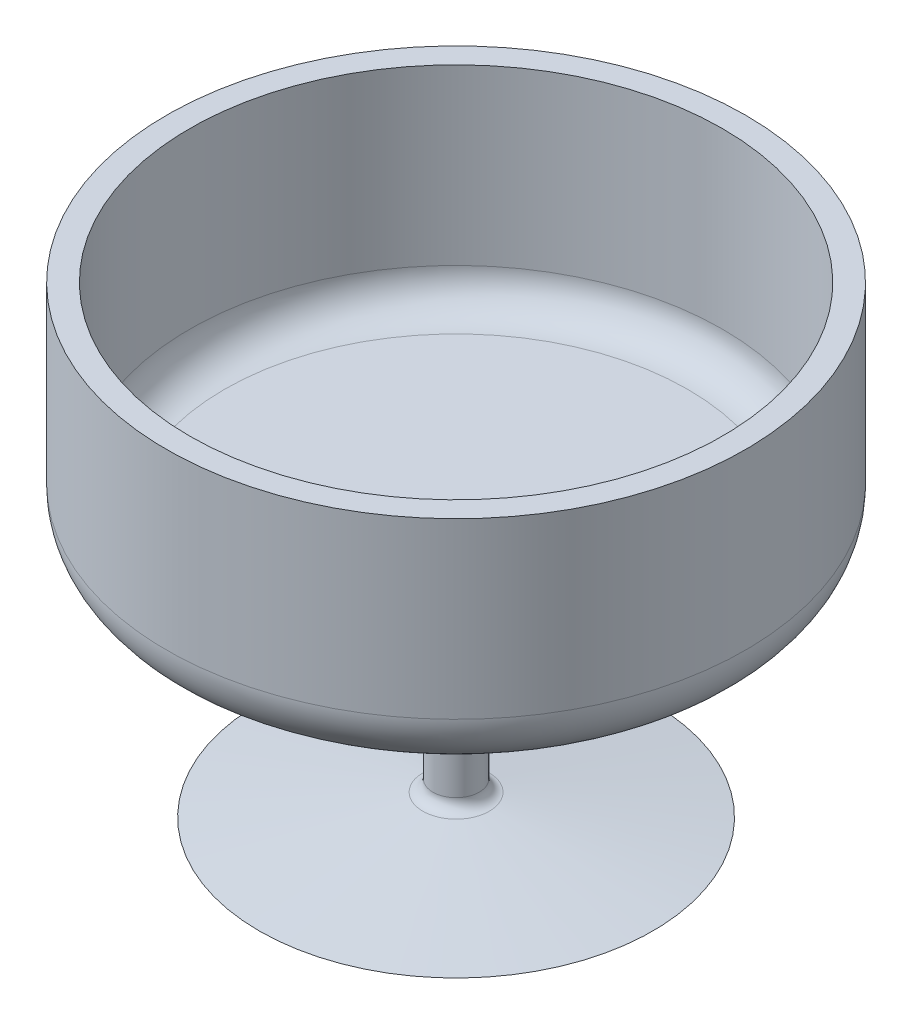
ISO-10303-21;
HEADER;
FILE_DESCRIPTION(('STEP AP214'),'2;1');
FILE_NAME('part.step','',(''),(''),'','','');
FILE_SCHEMA(('AUTOMOTIVE_DESIGN { 1 0 10303 214 1 1 1 1 }'));
ENDSEC;
DATA;
#1=APPLICATION_CONTEXT('core data for automotive mechanical design processes');
#2=APPLICATION_PROTOCOL_DEFINITION('international standard','automotive_design',2000,#1);
#3=PRODUCT_CONTEXT('',#1,'mechanical');
#4=PRODUCT('Part','Part','',(#3));
#5=PRODUCT_RELATED_PRODUCT_CATEGORY('part','',(#4));
#6=PRODUCT_DEFINITION_FORMATION('','',#4);
#7=PRODUCT_DEFINITION_CONTEXT('part definition',#1,'design');
#8=PRODUCT_DEFINITION('design','',#6,#7);
#9=PRODUCT_DEFINITION_SHAPE('','',#8);
#10=(LENGTH_UNIT() NAMED_UNIT(*) SI_UNIT(.MILLI.,.METRE.));
#11=(NAMED_UNIT(*) PLANE_ANGLE_UNIT() SI_UNIT($,.RADIAN.));
#12=(NAMED_UNIT(*) SI_UNIT($,.STERADIAN.) SOLID_ANGLE_UNIT());
#13=UNCERTAINTY_MEASURE_WITH_UNIT(LENGTH_MEASURE(1.E-05),#10,'distance_accuracy_value','');
#14=(GEOMETRIC_REPRESENTATION_CONTEXT(3) GLOBAL_UNCERTAINTY_ASSIGNED_CONTEXT((#13)) GLOBAL_UNIT_ASSIGNED_CONTEXT((#10,
#11,#12)) REPRESENTATION_CONTEXT('',''));
#15=CARTESIAN_POINT('',(0.,0.,0.));
#16=DIRECTION('',(0.,0.,1.));
#17=DIRECTION('',(1.,0.,0.));
#18=AXIS2_PLACEMENT_3D('',#15,#16,#17);
#19=CARTESIAN_POINT('',(17.,0.,0.));
#20=DIRECTION('',(0.,-1.,0.));
#21=DIRECTION('',(0.,0.,-1.));
#22=AXIS2_PLACEMENT_3D('',#19,#20,#21);
#23=PLANE('',#22);
#24=CARTESIAN_POINT('',(0.,0.,0.));
#25=DIRECTION('',(0.,-1.,0.));
#26=DIRECTION('',(0.,0.,-1.));
#27=AXIS2_PLACEMENT_3D('',#24,#25,#26);
#28=CIRCLE('',#27,17.);
#29=CARTESIAN_POINT('',(0.,0.,-17.));
#30=VERTEX_POINT('',#29);
#31=EDGE_CURVE('E69',#30,#30,#28,.T.);
#32=ORIENTED_EDGE('',*,*,#31,.T.);
#33=EDGE_LOOP('',(#32));
#34=FACE_BOUND('',#33,.T.);
#35=ADVANCED_FACE('F37',(#34),#23,.T.);
#36=CARTESIAN_POINT('',(0.,40.,0.));
#37=DIRECTION('',(0.,1.,0.));
#38=DIRECTION('',(0.,0.,1.));
#39=AXIS2_PLACEMENT_3D('',#36,#37,#38);
#40=PLANE('',#39);
#41=CARTESIAN_POINT('',(0.,40.,0.));
#42=DIRECTION('',(0.,1.,0.));
#43=DIRECTION('',(0.,0.,1.));
#44=AXIS2_PLACEMENT_3D('',#41,#42,#43);
#45=CIRCLE('',#44,23.);
#46=CARTESIAN_POINT('',(0.,40.,23.));
#47=VERTEX_POINT('',#46);
#48=EDGE_CURVE('E81',#47,#47,#45,.T.);
#49=ORIENTED_EDGE('',*,*,#48,.F.);
#50=EDGE_LOOP('',(#49));
#51=FACE_BOUND('',#50,.T.);
#52=CARTESIAN_POINT('',(0.,40.,0.));
#53=DIRECTION('',(0.,-1.,0.));
#54=DIRECTION('',(0.,0.,-1.));
#55=AXIS2_PLACEMENT_3D('',#52,#53,#54);
#56=CIRCLE('',#55,25.);
#57=CARTESIAN_POINT('',(0.,40.,-25.));
#58=VERTEX_POINT('',#57);
#59=EDGE_CURVE('E61',#58,#58,#56,.T.);
#60=ORIENTED_EDGE('',*,*,#59,.F.);
#61=EDGE_LOOP('',(#60));
#62=FACE_BOUND('',#61,.T.);
#63=ADVANCED_FACE('F89',(#51,#62),#40,.T.);
#64=CARTESIAN_POINT('',(0.,0.,0.));
#65=DIRECTION('',(0.,-1.,0.));
#66=DIRECTION('',(0.,0.,-1.));
#67=AXIS2_PLACEMENT_3D('',#64,#65,#66);
#68=CYLINDRICAL_SURFACE('',#67,25.);
#69=CARTESIAN_POINT('',(0.,25.,0.));
#70=DIRECTION('',(0.,-1.,0.));
#71=DIRECTION('',(0.,0.,-1.));
#72=AXIS2_PLACEMENT_3D('',#69,#70,#71);
#73=CIRCLE('',#72,25.);
#74=CARTESIAN_POINT('',(0.,25.,-25.));
#75=VERTEX_POINT('',#74);
#76=EDGE_CURVE('E50',#75,#75,#73,.F.);
#77=ORIENTED_EDGE('',*,*,#76,.T.);
#78=EDGE_LOOP('',(#77));
#79=FACE_BOUND('',#78,.T.);
#80=ORIENTED_EDGE('',*,*,#59,.T.);
#81=EDGE_LOOP('',(#80));
#82=FACE_BOUND('',#81,.T.);
#83=ADVANCED_FACE('F92',(#79,#82),#68,.T.);
#84=CARTESIAN_POINT('',(25.,20.,0.));
#85=DIRECTION('',(0.,-1.,0.));
#86=DIRECTION('',(0.,0.,-1.));
#87=AXIS2_PLACEMENT_3D('',#84,#85,#86);
#88=PLANE('',#87);
#89=CARTESIAN_POINT('',(0.,20.,0.));
#90=DIRECTION('',(0.,-1.,0.));
#91=DIRECTION('',(0.,0.,-1.));
#92=AXIS2_PLACEMENT_3D('',#89,#90,#91);
#93=CIRCLE('',#92,20.);
#94=CARTESIAN_POINT('',(0.,20.,-20.));
#95=VERTEX_POINT('',#94);
#96=EDGE_CURVE('E55',#95,#95,#93,.T.);
#97=ORIENTED_EDGE('',*,*,#96,.T.);
#98=EDGE_LOOP('',(#97));
#99=FACE_BOUND('',#98,.T.);
#100=CARTESIAN_POINT('',(0.,20.,0.));
#101=DIRECTION('',(0.,-1.,0.));
#102=DIRECTION('',(0.,0.,-1.));
#103=AXIS2_PLACEMENT_3D('',#100,#101,#102);
#104=CIRCLE('',#103,2.);
#105=CARTESIAN_POINT('',(0.,20.,-2.));
#106=VERTEX_POINT('',#105);
#107=EDGE_CURVE('E65',#106,#106,#104,.T.);
#108=ORIENTED_EDGE('',*,*,#107,.F.);
#109=EDGE_LOOP('',(#108));
#110=FACE_BOUND('',#109,.T.);
#111=ADVANCED_FACE('F97',(#99,#110),#88,.T.);
#112=CARTESIAN_POINT('',(0.,0.,0.));
#113=DIRECTION('',(0.,-1.,0.));
#114=DIRECTION('',(0.,0.,-1.));
#115=AXIS2_PLACEMENT_3D('',#112,#113,#114);
#116=CYLINDRICAL_SURFACE('',#115,2.);
#117=CARTESIAN_POINT('',(0.,2.87551639669477,0.));
#118=DIRECTION('',(0.,-1.,0.));
#119=DIRECTION('',(0.,0.,-1.));
#120=AXIS2_PLACEMENT_3D('',#117,#118,#119);
#121=CIRCLE('',#120,2.);
#122=CARTESIAN_POINT('',(0.,2.87551639669477,-2.));
#123=VERTEX_POINT('',#122);
#124=EDGE_CURVE('E10',#123,#123,#121,.F.);
#125=ORIENTED_EDGE('',*,*,#124,.T.);
#126=EDGE_LOOP('',(#125));
#127=FACE_BOUND('',#126,.T.);
#128=ORIENTED_EDGE('',*,*,#107,.T.);
#129=EDGE_LOOP('',(#128));
#130=FACE_BOUND('',#129,.T.);
#131=ADVANCED_FACE('F103',(#127,#130),#116,.T.);
#132=CARTESIAN_POINT('',(0.,0.,0.));
#133=DIRECTION('',(0.,-1.,0.));
#134=DIRECTION('',(0.,0.,-1.));
#135=AXIS2_PLACEMENT_3D('',#132,#133,#134);
#136=CONICAL_SURFACE('',#135,17.,1.43824479449822);
#137=CARTESIAN_POINT('',(0.,1.88428849601214,0.));
#138=DIRECTION('',(0.,-1.,0.));
#139=DIRECTION('',(0.,0.,-1.));
#140=AXIS2_PLACEMENT_3D('',#137,#138,#139);
#141=CIRCLE('',#140,2.86783627990898);
#142=CARTESIAN_POINT('',(0.,1.88428849601214,-2.86783627990898));
#143=VERTEX_POINT('',#142);
#144=EDGE_CURVE('E45',#143,#143,#141,.T.);
#145=CARTESIAN_POINT('',(0.,1.88428849601214,-2.86783627990898));
#146=CARTESIAN_POINT('',(0.,1.86466049084534,-3.01504631865993));
#147=CARTESIAN_POINT('',(0.,1.84503248567855,-3.16225635741088));
#148=CARTESIAN_POINT('',(0.,1.80577647534496,-3.45667643491277));
#149=CARTESIAN_POINT('',(0.,1.78614847017817,-3.60388647366372));
#150=CARTESIAN_POINT('',(0.,1.74689245984458,-3.89830655116562));
#151=CARTESIAN_POINT('',(0.,1.72726445467779,-4.04551658991656));
#152=CARTESIAN_POINT('',(0.,1.6880084443442,-4.33993666741846));
#153=CARTESIAN_POINT('',(0.,1.66838043917741,-4.48714670616941));
#154=CARTESIAN_POINT('',(0.,1.62912442884383,-4.7815667836713));
#155=CARTESIAN_POINT('',(0.,1.60949642367703,-4.92877682242225));
#156=CARTESIAN_POINT('',(0.,1.57024041334345,-5.22319689992415));
#157=CARTESIAN_POINT('',(0.,1.55061240817665,-5.3704069386751));
#158=CARTESIAN_POINT('',(0.,1.51135639784307,-5.66482701617699));
#159=CARTESIAN_POINT('',(0.,1.49172839267627,-5.81203705492794));
#160=CARTESIAN_POINT('',(0.,1.45247238234269,-6.10645713242984));
#161=CARTESIAN_POINT('',(0.,1.43284437717589,-6.25366717118079));
#162=CARTESIAN_POINT('',(0.,1.39358836684231,-6.54808724868268));
#163=CARTESIAN_POINT('',(0.,1.37396036167552,-6.69529728743363));
#164=CARTESIAN_POINT('',(0.,1.33470435134193,-6.98971736493553));
#165=CARTESIAN_POINT('',(0.,1.31507634617514,-7.13692740368648));
#166=CARTESIAN_POINT('',(0.,1.27582033584155,-7.43134748118837));
#167=CARTESIAN_POINT('',(0.,1.25619233067476,-7.57855751993932));
#168=CARTESIAN_POINT('',(0.,1.21693632034117,-7.87297759744122));
#169=CARTESIAN_POINT('',(0.,1.19730831517438,-8.02018763619216));
#170=CARTESIAN_POINT('',(0.,1.15805230484079,-8.31460771369406));
#171=CARTESIAN_POINT('',(0.,1.138424299674,-8.46181775244501));
#172=CARTESIAN_POINT('',(0.,1.09916828934041,-8.75623782994691));
#173=CARTESIAN_POINT('',(0.,1.07954028417362,-8.90344786869785));
#174=CARTESIAN_POINT('',(0.,1.04028427384003,-9.19786794619975));
#175=CARTESIAN_POINT('',(0.,1.02065626867324,-9.3450779849507));
#176=CARTESIAN_POINT('',(0.,0.981400258339654,-9.63949806245259));
#177=CARTESIAN_POINT('',(0.,0.961772253172861,-9.78670810120354));
#178=CARTESIAN_POINT('',(0.,0.922516242839275,-10.0811281787054));
#179=CARTESIAN_POINT('',(0.,0.902888237672482,-10.2283382174564));
#180=CARTESIAN_POINT('',(0.,0.863632227338895,-10.5227582949583));
#181=CARTESIAN_POINT('',(0.,0.844004222172102,-10.6699683337092));
#182=CARTESIAN_POINT('',(0.,0.804748211838516,-10.9643884112111));
#183=CARTESIAN_POINT('',(0.,0.785120206671723,-11.1115984499621));
#184=CARTESIAN_POINT('',(0.,0.745864196338137,-11.406018527464));
#185=CARTESIAN_POINT('',(0.,0.726236191171344,-11.5532285662149));
#186=CARTESIAN_POINT('',(0.,0.686980180837758,-11.8476486437168));
#187=CARTESIAN_POINT('',(0.,0.667352175670965,-11.9948586824678));
#188=CARTESIAN_POINT('',(0.,0.628096165337379,-12.2892787599697));
#189=CARTESIAN_POINT('',(0.,0.608468160170586,-12.4364887987206));
#190=CARTESIAN_POINT('',(0.,0.569212149836999,-12.7309088762225));
#191=CARTESIAN_POINT('',(0.,0.549584144670206,-12.8781189149735));
#192=CARTESIAN_POINT('',(0.,0.51032813433662,-13.1725389924753));
#193=CARTESIAN_POINT('',(0.,0.490700129169827,-13.3197490312263));
#194=CARTESIAN_POINT('',(0.,0.451444118836241,-13.6141691087282));
#195=CARTESIAN_POINT('',(0.,0.431816113669448,-13.7613791474791));
#196=CARTESIAN_POINT('',(0.,0.392560103335861,-14.055799224981));
#197=CARTESIAN_POINT('',(0.,0.372932098169068,-14.203009263732));
#198=CARTESIAN_POINT('',(0.,0.333676087835482,-14.4974293412339));
#199=CARTESIAN_POINT('',(0.,0.314048082668689,-14.6446393799848));
#200=CARTESIAN_POINT('',(0.,0.274792072335103,-14.9390594574867));
#201=CARTESIAN_POINT('',(0.,0.25516406716831,-15.0862694962377));
#202=CARTESIAN_POINT('',(0.,0.215908056834724,-15.3806895737396));
#203=CARTESIAN_POINT('',(0.,0.196280051667931,-15.5278996124905));
#204=CARTESIAN_POINT('',(0.,0.157024041334344,-15.8223196899924));
#205=CARTESIAN_POINT('',(0.,0.137396036167551,-15.9695297287434));
#206=CARTESIAN_POINT('',(0.,0.0981400258339653,-16.2639498062453));
#207=CARTESIAN_POINT('',(0.,0.0785120206671723,-16.4111598449962));
#208=CARTESIAN_POINT('',(0.,0.039256010333586,-16.7055799224981));
#209=CARTESIAN_POINT('',(0.,0.0196280051667928,-16.8527899612491));
#210=CARTESIAN_POINT('',(0.,0.,-17.));
#211=B_SPLINE_CURVE_WITH_KNOTS('',3,(#145,#146,#147,#148,#149,#150,#151,#152,#153,#154,#155,
#156,#157,#158,#159,#160,#161,#162,#163,#164,#165,#166,#167,#168,#169,#170,#171,#172,#173,#174,
#175,#176,#177,#178,#179,#180,#181,#182,#183,#184,#185,#186,#187,#188,#189,#190,#191,#192,#193,
#194,#195,#196,#197,#198,#199,#200,#201,#202,#203,#204,#205,#206,#207,#208,#209,#210),
.UNSPECIFIED.,.F.,.F.,(4,2,2,2,2,2,2,2,2,2,2,2,2,2,2,2,2,2,2,2,2,2,2,2,2,2,2,2,2,2,2,2,4),(0.,
0.445538423553964,0.891076847107924,1.33661527066189,1.78215369421585,2.22769211776981,
2.67323054132377,3.11876896487774,3.5643073884317,4.00984581198566,4.45538423553962,
4.90092265909358,5.34646108264755,5.79199950620151,6.23753792975547,6.68307635330943,
7.1286147768634,7.57415320041736,8.01969162397132,8.46523004752529,8.91076847107924,
9.35630689463321,9.80184531818717,10.2473837417411,10.6929221652951,11.1384605888491,
11.583999012403,12.029537435957,12.4750758595109,12.9206142830649,13.3661527066189,
13.8116911301728,14.2572295537268),.UNSPECIFIED.);
#212=EDGE_CURVE('BSEAM113',#143,#30,#211,.T.);
#213=ORIENTED_EDGE('',*,*,#144,.T.);
#214=ORIENTED_EDGE('',*,*,#31,.F.);
#215=ORIENTED_EDGE('',*,*,#212,.T.);
#216=ORIENTED_EDGE('',*,*,#212,.F.);
#217=EDGE_LOOP('',(#213,#215,#214,#216));
#218=FACE_BOUND('',#217,.T.);
#219=ADVANCED_FACE('F113',(#218),#136,.T.);
#220=CARTESIAN_POINT('',(0.,25.,0.));
#221=DIRECTION('',(0.,-1.,0.));
#222=DIRECTION('',(0.,0.,-1.));
#223=AXIS2_PLACEMENT_3D('',#220,#221,#222);
#224=TOROIDAL_SURFACE('',#223,20.,5.);
#225=ORIENTED_EDGE('',*,*,#76,.F.);
#226=EDGE_LOOP('',(#225));
#227=FACE_BOUND('',#226,.T.);
#228=ORIENTED_EDGE('',*,*,#96,.F.);
#229=EDGE_LOOP('',(#228));
#230=FACE_BOUND('',#229,.T.);
#231=ADVANCED_FACE('F111',(#227,#230),#224,.T.);
#232=CARTESIAN_POINT('',(0.,2.87551639669477,0.));
#233=DIRECTION('',(0.,-1.,0.));
#234=DIRECTION('',(0.,0.,-1.));
#235=AXIS2_PLACEMENT_3D('',#232,#233,#234);
#236=TOROIDAL_SURFACE('',#235,3.,1.);
#237=ORIENTED_EDGE('',*,*,#124,.F.);
#238=EDGE_LOOP('',(#237));
#239=FACE_BOUND('',#238,.T.);
#240=ORIENTED_EDGE('',*,*,#144,.F.);
#241=EDGE_LOOP('',(#240));
#242=FACE_BOUND('',#241,.T.);
#243=ADVANCED_FACE('F39',(#239,#242),#236,.F.);
#244=CARTESIAN_POINT('',(0.,22.,0.));
#245=DIRECTION('',(0.,1.,0.));
#246=DIRECTION('',(0.,0.,1.));
#247=AXIS2_PLACEMENT_3D('',#244,#245,#246);
#248=PLANE('',#247);
#249=CARTESIAN_POINT('',(0.,22.,0.));
#250=DIRECTION('',(0.,1.,0.));
#251=DIRECTION('',(0.,0.,1.));
#252=AXIS2_PLACEMENT_3D('',#249,#250,#251);
#253=CIRCLE('',#252,20.);
#254=CARTESIAN_POINT('',(0.,22.,20.));
#255=VERTEX_POINT('',#254);
#256=EDGE_CURVE('E73',#255,#255,#253,.T.);
#257=ORIENTED_EDGE('',*,*,#256,.T.);
#258=EDGE_LOOP('',(#257));
#259=FACE_BOUND('',#258,.T.);
#260=ADVANCED_FACE('F119',(#259),#248,.T.);
#261=CARTESIAN_POINT('',(0.,25.,0.));
#262=DIRECTION('',(0.,1.,0.));
#263=DIRECTION('',(0.,0.,1.));
#264=AXIS2_PLACEMENT_3D('',#261,#262,#263);
#265=TOROIDAL_SURFACE('',#264,20.,3.);
#266=CARTESIAN_POINT('',(0.,25.,0.));
#267=DIRECTION('',(0.,1.,0.));
#268=DIRECTION('',(0.,0.,1.));
#269=AXIS2_PLACEMENT_3D('',#266,#267,#268);
#270=CIRCLE('',#269,23.);
#271=CARTESIAN_POINT('',(0.,25.,23.));
#272=VERTEX_POINT('',#271);
#273=EDGE_CURVE('E77',#272,#272,#270,.T.);
#274=ORIENTED_EDGE('',*,*,#273,.T.);
#275=EDGE_LOOP('',(#274));
#276=FACE_BOUND('',#275,.T.);
#277=ORIENTED_EDGE('',*,*,#256,.F.);
#278=EDGE_LOOP('',(#277));
#279=FACE_BOUND('',#278,.T.);
#280=ADVANCED_FACE('F135',(#276,#279),#265,.F.);
#281=CARTESIAN_POINT('',(0.,40.,0.));
#282=DIRECTION('',(0.,1.,0.));
#283=DIRECTION('',(0.,0.,1.));
#284=AXIS2_PLACEMENT_3D('',#281,#282,#283);
#285=CYLINDRICAL_SURFACE('',#284,23.);
#286=ORIENTED_EDGE('',*,*,#48,.T.);
#287=EDGE_LOOP('',(#286));
#288=FACE_BOUND('',#287,.T.);
#289=ORIENTED_EDGE('',*,*,#273,.F.);
#290=EDGE_LOOP('',(#289));
#291=FACE_BOUND('',#290,.T.);
#292=ADVANCED_FACE('F86',(#288,#291),#285,.F.);
#293=CLOSED_SHELL('',(#35,#63,#83,#111,#131,#219,#231,#243,#260,#280,#292));
#294=MANIFOLD_SOLID_BREP('B2',#293);
#295=ADVANCED_BREP_SHAPE_REPRESENTATION('',(#18,#294),#14);
#296=SHAPE_DEFINITION_REPRESENTATION(#9,#295);
ENDSEC;
END-ISO-10303-21;
